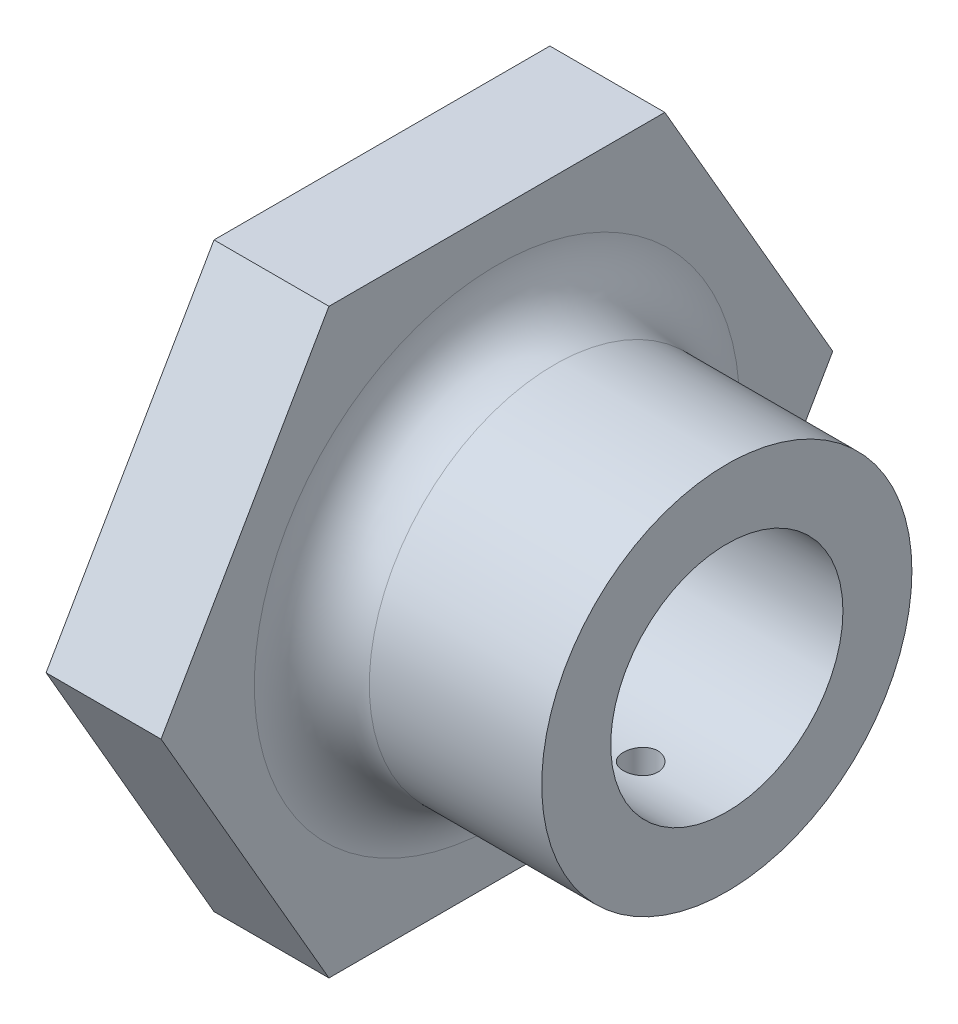
ISO-10303-21;
HEADER;
FILE_DESCRIPTION(('STEP AP214'),'2;1');
FILE_NAME('part.step','',(''),(''),'','','');
FILE_SCHEMA(('AUTOMOTIVE_DESIGN { 1 0 10303 214 1 1 1 1 }'));
ENDSEC;
DATA;
#1=APPLICATION_CONTEXT('core data for automotive mechanical design processes');
#2=APPLICATION_PROTOCOL_DEFINITION('international standard','automotive_design',2000,#1);
#3=PRODUCT_CONTEXT('',#1,'mechanical');
#4=PRODUCT('Part','Part','',(#3));
#5=PRODUCT_RELATED_PRODUCT_CATEGORY('part','',(#4));
#6=PRODUCT_DEFINITION_FORMATION('','',#4);
#7=PRODUCT_DEFINITION_CONTEXT('part definition',#1,'design');
#8=PRODUCT_DEFINITION('design','',#6,#7);
#9=PRODUCT_DEFINITION_SHAPE('','',#8);
#10=(LENGTH_UNIT() NAMED_UNIT(*) SI_UNIT(.MILLI.,.METRE.));
#11=(NAMED_UNIT(*) PLANE_ANGLE_UNIT() SI_UNIT($,.RADIAN.));
#12=(NAMED_UNIT(*) SI_UNIT($,.STERADIAN.) SOLID_ANGLE_UNIT());
#13=UNCERTAINTY_MEASURE_WITH_UNIT(LENGTH_MEASURE(1.E-05),#10,'distance_accuracy_value','');
#14=(GEOMETRIC_REPRESENTATION_CONTEXT(3) GLOBAL_UNCERTAINTY_ASSIGNED_CONTEXT((#13)) GLOBAL_UNIT_ASSIGNED_CONTEXT((#10,
#11,#12)) REPRESENTATION_CONTEXT('',''));
#15=CARTESIAN_POINT('',(0.,0.,0.));
#16=DIRECTION('',(0.,0.,1.));
#17=DIRECTION('',(1.,0.,0.));
#18=AXIS2_PLACEMENT_3D('',#15,#16,#17);
#19=CARTESIAN_POINT('',(10.,0.,0.));
#20=DIRECTION('',(1.,0.,0.));
#21=DIRECTION('',(0.,0.,-1.));
#22=AXIS2_PLACEMENT_3D('',#19,#20,#21);
#23=PLANE('',#22);
#24=CARTESIAN_POINT('',(10.,0.,0.));
#25=DIRECTION('',(1.,0.,0.));
#26=DIRECTION('',(0.,0.,-1.));
#27=AXIS2_PLACEMENT_3D('',#24,#25,#26);
#28=CIRCLE('',#27,21.1);
#29=CARTESIAN_POINT('',(10.,0.,-21.1));
#30=VERTEX_POINT('',#29);
#31=EDGE_CURVE('E11',#30,#30,#28,.F.);
#32=ORIENTED_EDGE('',*,*,#31,.T.);
#33=EDGE_LOOP('',(#32));
#34=FACE_BOUND('',#33,.T.);
#35=DIRECTION('',(0.,0.866025403784439,0.5));
#36=VECTOR('',#35,1.);
#37=CARTESIAN_POINT('',(10.,0.,-29.2139236209951));
#38=LINE('',#37,#36);
#39=CARTESIAN_POINT('',(10.,0.,-29.2139236209951));
#40=VERTEX_POINT('',#39);
#41=CARTESIAN_POINT('',(10.,25.3,-14.6069618104975));
#42=VERTEX_POINT('',#41);
#43=EDGE_CURVE('E155',#40,#42,#38,.T.);
#44=ORIENTED_EDGE('',*,*,#43,.T.);
#45=DIRECTION('',(0.,0.,1.));
#46=VECTOR('',#45,1.);
#47=CARTESIAN_POINT('',(10.,25.3,-14.6069618104975));
#48=LINE('',#47,#46);
#49=CARTESIAN_POINT('',(10.,25.3,14.6069618104975));
#50=VERTEX_POINT('',#49);
#51=EDGE_CURVE('E104',#42,#50,#48,.T.);
#52=ORIENTED_EDGE('',*,*,#51,.T.);
#53=DIRECTION('',(0.,-0.866025403784438,0.500000000000001));
#54=VECTOR('',#53,1.);
#55=CARTESIAN_POINT('',(10.,25.3,14.6069618104975));
#56=LINE('',#55,#54);
#57=CARTESIAN_POINT('',(10.,0.,29.2139236209951));
#58=VERTEX_POINT('',#57);
#59=EDGE_CURVE('E116',#50,#58,#56,.T.);
#60=ORIENTED_EDGE('',*,*,#59,.T.);
#61=DIRECTION('',(0.,-0.866025403784438,-0.500000000000001));
#62=VECTOR('',#61,1.);
#63=CARTESIAN_POINT('',(10.,0.,29.2139236209951));
#64=LINE('',#63,#62);
#65=CARTESIAN_POINT('',(10.,-25.3,14.6069618104975));
#66=VERTEX_POINT('',#65);
#67=EDGE_CURVE('E111',#58,#66,#64,.T.);
#68=ORIENTED_EDGE('',*,*,#67,.T.);
#69=DIRECTION('',(0.,0.,-1.));
#70=VECTOR('',#69,1.);
#71=CARTESIAN_POINT('',(10.,-25.3,14.6069618104975));
#72=LINE('',#71,#70);
#73=CARTESIAN_POINT('',(10.,-25.3,-14.6069618104975));
#74=VERTEX_POINT('',#73);
#75=EDGE_CURVE('E114',#66,#74,#72,.T.);
#76=ORIENTED_EDGE('',*,*,#75,.T.);
#77=DIRECTION('',(0.,0.866025403784438,-0.5));
#78=VECTOR('',#77,1.);
#79=CARTESIAN_POINT('',(10.,-25.3,-14.6069618104975));
#80=LINE('',#79,#78);
#81=EDGE_CURVE('E66',#74,#40,#80,.T.);
#82=ORIENTED_EDGE('',*,*,#81,.T.);
#83=EDGE_LOOP('',(#44,#52,#60,#68,#76,#82));
#84=FACE_BOUND('',#83,.T.);
#85=ADVANCED_FACE('F42',(#34,#84),#23,.T.);
#86=CARTESIAN_POINT('',(0.,0.,0.));
#87=DIRECTION('',(1.,0.,0.));
#88=DIRECTION('',(0.,0.,-1.));
#89=AXIS2_PLACEMENT_3D('',#86,#87,#88);
#90=PLANE('',#89);
#91=DIRECTION('',(0.,0.866025403784439,0.5));
#92=VECTOR('',#91,1.);
#93=CARTESIAN_POINT('',(0.,0.,-29.2139236209951));
#94=LINE('',#93,#92);
#95=CARTESIAN_POINT('',(0.,0.,-29.2139236209951));
#96=VERTEX_POINT('',#95);
#97=CARTESIAN_POINT('',(0.,25.3,-14.6069618104975));
#98=VERTEX_POINT('',#97);
#99=EDGE_CURVE('E138',#96,#98,#94,.T.);
#100=ORIENTED_EDGE('',*,*,#99,.F.);
#101=DIRECTION('',(0.,0.866025403784438,-0.5));
#102=VECTOR('',#101,1.);
#103=CARTESIAN_POINT('',(0.,-25.3,-14.6069618104975));
#104=LINE('',#103,#102);
#105=CARTESIAN_POINT('',(0.,-25.3,-14.6069618104975));
#106=VERTEX_POINT('',#105);
#107=EDGE_CURVE('E95',#106,#96,#104,.T.);
#108=ORIENTED_EDGE('',*,*,#107,.F.);
#109=DIRECTION('',(0.,0.,-1.));
#110=VECTOR('',#109,1.);
#111=CARTESIAN_POINT('',(0.,-25.3,14.6069618104975));
#112=LINE('',#111,#110);
#113=CARTESIAN_POINT('',(0.,-25.3,14.6069618104975));
#114=VERTEX_POINT('',#113);
#115=EDGE_CURVE('E89',#114,#106,#112,.T.);
#116=ORIENTED_EDGE('',*,*,#115,.F.);
#117=DIRECTION('',(0.,-0.866025403784438,-0.500000000000001));
#118=VECTOR('',#117,1.);
#119=CARTESIAN_POINT('',(0.,0.,29.2139236209951));
#120=LINE('',#119,#118);
#121=CARTESIAN_POINT('',(0.,0.,29.2139236209951));
#122=VERTEX_POINT('',#121);
#123=EDGE_CURVE('E125',#122,#114,#120,.T.);
#124=ORIENTED_EDGE('',*,*,#123,.F.);
#125=DIRECTION('',(0.,-0.866025403784438,0.500000000000001));
#126=VECTOR('',#125,1.);
#127=CARTESIAN_POINT('',(0.,25.3,14.6069618104975));
#128=LINE('',#127,#126);
#129=CARTESIAN_POINT('',(0.,25.3,14.6069618104975));
#130=VERTEX_POINT('',#129);
#131=EDGE_CURVE('E146',#130,#122,#128,.T.);
#132=ORIENTED_EDGE('',*,*,#131,.F.);
#133=DIRECTION('',(0.,0.,1.));
#134=VECTOR('',#133,1.);
#135=CARTESIAN_POINT('',(0.,25.3,-14.6069618104975));
#136=LINE('',#135,#134);
#137=EDGE_CURVE('E142',#98,#130,#136,.T.);
#138=ORIENTED_EDGE('',*,*,#137,.F.);
#139=EDGE_LOOP('',(#100,#108,#116,#124,#132,#138));
#140=FACE_BOUND('',#139,.T.);
#141=CARTESIAN_POINT('',(0.,0.,0.));
#142=DIRECTION('',(1.,0.,0.));
#143=DIRECTION('',(0.,0.,-1.));
#144=AXIS2_PLACEMENT_3D('',#141,#142,#143);
#145=CIRCLE('',#144,10.1);
#146=CARTESIAN_POINT('',(0.,0.,-10.1));
#147=VERTEX_POINT('',#146);
#148=EDGE_CURVE('E143',#147,#147,#145,.T.);
#149=ORIENTED_EDGE('',*,*,#148,.T.);
#150=EDGE_LOOP('',(#149));
#151=FACE_BOUND('',#150,.T.);
#152=ADVANCED_FACE('F189',(#140,#151),#90,.F.);
#153=CARTESIAN_POINT('',(10.,0.,-29.2139236209951));
#154=DIRECTION('',(0.,-0.5,0.866025403784439));
#155=DIRECTION('',(0.,-0.866025403784439,-0.5));
#156=AXIS2_PLACEMENT_3D('',#153,#154,#155);
#157=PLANE('',#156);
#158=ORIENTED_EDGE('',*,*,#99,.T.);
#159=DIRECTION('',(-1.,0.,0.));
#160=VECTOR('',#159,1.);
#161=CARTESIAN_POINT('',(10.,25.3,-14.6069618104975));
#162=LINE('',#161,#160);
#163=EDGE_CURVE('E166',#42,#98,#162,.T.);
#164=ORIENTED_EDGE('',*,*,#163,.F.);
#165=ORIENTED_EDGE('',*,*,#43,.F.);
#166=DIRECTION('',(-1.,0.,0.));
#167=VECTOR('',#166,1.);
#168=CARTESIAN_POINT('',(10.,0.,-29.2139236209951));
#169=LINE('',#168,#167);
#170=EDGE_CURVE('E134',#40,#96,#169,.T.);
#171=ORIENTED_EDGE('',*,*,#170,.T.);
#172=EDGE_LOOP('',(#158,#164,#165,#171));
#173=FACE_BOUND('',#172,.T.);
#174=ADVANCED_FACE('F195',(#173),#157,.F.);
#175=CARTESIAN_POINT('',(10.,25.3,-14.6069618104975));
#176=DIRECTION('',(0.,-1.,0.));
#177=DIRECTION('',(0.,0.,-1.));
#178=AXIS2_PLACEMENT_3D('',#175,#176,#177);
#179=PLANE('',#178);
#180=ORIENTED_EDGE('',*,*,#137,.T.);
#181=DIRECTION('',(-1.,0.,0.));
#182=VECTOR('',#181,1.);
#183=CARTESIAN_POINT('',(10.,25.3,14.6069618104975));
#184=LINE('',#183,#182);
#185=EDGE_CURVE('E162',#50,#130,#184,.T.);
#186=ORIENTED_EDGE('',*,*,#185,.F.);
#187=ORIENTED_EDGE('',*,*,#51,.F.);
#188=ORIENTED_EDGE('',*,*,#163,.T.);
#189=EDGE_LOOP('',(#180,#186,#187,#188));
#190=FACE_BOUND('',#189,.T.);
#191=ADVANCED_FACE('F212',(#190),#179,.F.);
#192=CARTESIAN_POINT('',(10.,25.3,14.6069618104975));
#193=DIRECTION('',(0.,-0.500000000000001,-0.866025403784438));
#194=DIRECTION('',(0.,0.866025403784438,-0.500000000000001));
#195=AXIS2_PLACEMENT_3D('',#192,#193,#194);
#196=PLANE('',#195);
#197=ORIENTED_EDGE('',*,*,#131,.T.);
#198=DIRECTION('',(-1.,0.,0.));
#199=VECTOR('',#198,1.);
#200=CARTESIAN_POINT('',(10.,0.,29.2139236209951));
#201=LINE('',#200,#199);
#202=EDGE_CURVE('E127',#58,#122,#201,.T.);
#203=ORIENTED_EDGE('',*,*,#202,.F.);
#204=ORIENTED_EDGE('',*,*,#59,.F.);
#205=ORIENTED_EDGE('',*,*,#185,.T.);
#206=EDGE_LOOP('',(#197,#203,#204,#205));
#207=FACE_BOUND('',#206,.T.);
#208=ADVANCED_FACE('F209',(#207),#196,.F.);
#209=CARTESIAN_POINT('',(10.,0.,29.2139236209951));
#210=DIRECTION('',(0.,0.500000000000001,-0.866025403784438));
#211=DIRECTION('',(0.,0.866025403784438,0.500000000000001));
#212=AXIS2_PLACEMENT_3D('',#209,#210,#211);
#213=PLANE('',#212);
#214=ORIENTED_EDGE('',*,*,#123,.T.);
#215=DIRECTION('',(-1.,0.,0.));
#216=VECTOR('',#215,1.);
#217=CARTESIAN_POINT('',(10.,-25.3,14.6069618104975));
#218=LINE('',#217,#216);
#219=EDGE_CURVE('E122',#66,#114,#218,.T.);
#220=ORIENTED_EDGE('',*,*,#219,.F.);
#221=ORIENTED_EDGE('',*,*,#67,.F.);
#222=ORIENTED_EDGE('',*,*,#202,.T.);
#223=EDGE_LOOP('',(#214,#220,#221,#222));
#224=FACE_BOUND('',#223,.T.);
#225=ADVANCED_FACE('F123',(#224),#213,.F.);
#226=CARTESIAN_POINT('',(10.,-25.3,14.6069618104975));
#227=DIRECTION('',(0.,1.,0.));
#228=DIRECTION('',(0.,0.,1.));
#229=AXIS2_PLACEMENT_3D('',#226,#227,#228);
#230=PLANE('',#229);
#231=ORIENTED_EDGE('',*,*,#115,.T.);
#232=DIRECTION('',(-1.,0.,0.));
#233=VECTOR('',#232,1.);
#234=CARTESIAN_POINT('',(10.,-25.3,-14.6069618104975));
#235=LINE('',#234,#233);
#236=EDGE_CURVE('E128',#74,#106,#235,.T.);
#237=ORIENTED_EDGE('',*,*,#236,.F.);
#238=ORIENTED_EDGE('',*,*,#75,.F.);
#239=ORIENTED_EDGE('',*,*,#219,.T.);
#240=EDGE_LOOP('',(#231,#237,#238,#239));
#241=FACE_BOUND('',#240,.T.);
#242=ADVANCED_FACE('F130',(#241),#230,.F.);
#243=CARTESIAN_POINT('',(10.,-25.3,-14.6069618104975));
#244=DIRECTION('',(0.,0.5,0.866025403784439));
#245=DIRECTION('',(0.,-0.866025403784439,0.5));
#246=AXIS2_PLACEMENT_3D('',#243,#244,#245);
#247=PLANE('',#246);
#248=ORIENTED_EDGE('',*,*,#107,.T.);
#249=ORIENTED_EDGE('',*,*,#170,.F.);
#250=ORIENTED_EDGE('',*,*,#81,.F.);
#251=ORIENTED_EDGE('',*,*,#236,.T.);
#252=EDGE_LOOP('',(#248,#249,#250,#251));
#253=FACE_BOUND('',#252,.T.);
#254=ADVANCED_FACE('F202',(#253),#247,.F.);
#255=CARTESIAN_POINT('',(10.,0.,0.));
#256=DIRECTION('',(-1.,0.,0.));
#257=DIRECTION('',(0.,0.,1.));
#258=AXIS2_PLACEMENT_3D('',#255,#256,#257);
#259=CYLINDRICAL_SURFACE('',#258,10.1);
#260=CARTESIAN_POINT('',(22.5,-9.98799279134702,1.5));
#261=CARTESIAN_POINT('',(22.5837556512332,-9.9879941807315,1.49999653344231));
#262=CARTESIAN_POINT('',(22.6675601617615,-9.98905770648355,1.49296127254229));
#263=CARTESIAN_POINT('',(22.8328267929498,-9.99319409703962,1.4650131891143));
#264=CARTESIAN_POINT('',(22.9142865366908,-9.9962689306879,1.4440867684053));
#265=CARTESIAN_POINT('',(23.0724474787311,-10.0040721668359,1.38899565010733));
#266=CARTESIAN_POINT('',(23.149152250213,-10.0087993095095,1.3548410364022));
#267=CARTESIAN_POINT('',(23.2957309647537,-10.0193730361715,1.27428666965844));
#268=CARTESIAN_POINT('',(23.3656058608875,-10.0252194636316,1.22788862848154));
#269=CARTESIAN_POINT('',(23.4971009366153,-10.0374243377324,1.12377540451144));
#270=CARTESIAN_POINT('',(23.5586597230782,-10.0437860907059,1.06598306009875));
#271=CARTESIAN_POINT('',(23.6712432372395,-10.0562752827391,0.940888332795035));
#272=CARTESIAN_POINT('',(23.7222673894038,-10.062402708982,0.873585430655923));
#273=CARTESIAN_POINT('',(23.8125593921792,-10.0737674010683,0.730987203197164));
#274=CARTESIAN_POINT('',(23.8517707657327,-10.0790003404198,0.655655742883641));
#275=CARTESIAN_POINT('',(23.9169617566082,-10.0879498450303,0.499385477087391));
#276=CARTESIAN_POINT('',(23.9429420595836,-10.091666488864,0.418446962417423));
#277=CARTESIAN_POINT('',(23.980747474383,-10.0971413144263,0.253892161972045));
#278=CARTESIAN_POINT('',(23.9926753521047,-10.0989137078675,0.170299966480003));
#279=CARTESIAN_POINT('',(24.0023563839315,-10.1003490286794,0.00228305764693207));
#280=CARTESIAN_POINT('',(24.0001103112272,-10.1000120711155,-0.0821416100318046));
#281=CARTESIAN_POINT('',(23.9815883797276,-10.0972780203372,-0.248725950780093));
#282=CARTESIAN_POINT('',(23.9654230786419,-10.094897161874,-0.330898220633102));
#283=CARTESIAN_POINT('',(23.919695058241,-10.088360916662,-0.491350729660537));
#284=CARTESIAN_POINT('',(23.8901319996451,-10.0842054849745,-0.569630870216146));
#285=CARTESIAN_POINT('',(23.8183341879558,-10.0745590881838,-0.720412155832025));
#286=CARTESIAN_POINT('',(23.776052808761,-10.0690632232448,-0.792890772625558));
#287=CARTESIAN_POINT('',(23.6800526028127,-10.0573486227851,-0.929765956778822));
#288=CARTESIAN_POINT('',(23.6263330378038,-10.051129840617,-0.994162002038074));
#289=CARTESIAN_POINT('',(23.5083652560932,-10.03859232388,-1.11369563859232));
#290=CARTESIAN_POINT('',(23.44402052403,-10.0322732037026,-1.1687379815968));
#291=CARTESIAN_POINT('',(23.3069570643873,-10.0203057456663,-1.26725821808431));
#292=CARTESIAN_POINT('',(23.2342382871509,-10.0146574117855,-1.31073604298635));
#293=CARTESIAN_POINT('',(23.0823926007829,-10.0046711709491,-1.38490545914184));
#294=CARTESIAN_POINT('',(23.0032609080838,-10.000334253838,-1.41558739877766));
#295=CARTESIAN_POINT('',(22.840888884425,-9.99347951155194,-1.46319899968337));
#296=CARTESIAN_POINT('',(22.7576488374597,-9.99096156082662,-1.48012961012051));
#297=CARTESIAN_POINT('',(22.5902700235005,-9.98805360190675,-1.49962761276662));
#298=CARTESIAN_POINT('',(22.5061473130276,-9.9876436002483,-1.50232996303392));
#299=CARTESIAN_POINT('',(22.3386501996047,-9.98894489300218,-1.49365271180531));
#300=CARTESIAN_POINT('',(22.2552757739864,-9.99065612293453,-1.48227353835142));
#301=CARTESIAN_POINT('',(22.0920591507292,-9.99598870786081,-1.44587066238782));
#302=CARTESIAN_POINT('',(22.0122016501112,-9.99960066436801,-1.42091407548796));
#303=CARTESIAN_POINT('',(21.8578033759366,-10.0083199834493,-1.3581345672902));
#304=CARTESIAN_POINT('',(21.7832628603966,-10.0134274185329,-1.32031102211212));
#305=CARTESIAN_POINT('',(21.6410091493569,-10.0246093694854,-1.23254652968968));
#306=CARTESIAN_POINT('',(21.5733504468162,-10.0306907495831,-1.18251814675273));
#307=CARTESIAN_POINT('',(21.4473408532376,-10.0431146428354,-1.07188578120655));
#308=CARTESIAN_POINT('',(21.3889904781607,-10.0494571704408,-1.0112812127487));
#309=CARTESIAN_POINT('',(21.2827698936081,-10.0617511338477,-0.880622772605109));
#310=CARTESIAN_POINT('',(21.23498907492,-10.0676989565668,-0.810495839364267));
#311=CARTESIAN_POINT('',(21.1518864466953,-10.0784773442146,-0.663132492509454));
#312=CARTESIAN_POINT('',(21.1165643018062,-10.0833079392147,-0.585896270328215));
#313=CARTESIAN_POINT('',(21.0595248253742,-10.091291750582,-0.426787036624583));
#314=CARTESIAN_POINT('',(21.0377584399907,-10.0944510086439,-0.344931926490835));
#315=CARTESIAN_POINT('',(21.0082895419628,-10.0987615273987,-0.178678114676162));
#316=CARTESIAN_POINT('',(21.0005861195543,-10.0999129179848,-0.0942795778942366));
#317=CARTESIAN_POINT('',(20.9994836894086,-10.1000767141153,0.0737979593676888));
#318=CARTESIAN_POINT('',(21.0059478396523,-10.0991095821349,0.157476074593947));
#319=CARTESIAN_POINT('',(21.0327039715024,-10.0951862237568,0.322541533858875));
#320=CARTESIAN_POINT('',(21.0529959113936,-10.0922300033599,0.403928884807488));
#321=CARTESIAN_POINT('',(21.1067834093708,-10.0846590903396,0.562066195806304));
#322=CARTESIAN_POINT('',(21.1402696768113,-10.0800455648914,0.638819375198153));
#323=CARTESIAN_POINT('',(21.2194807173352,-10.069667038128,0.785639125019117));
#324=CARTESIAN_POINT('',(21.2652058719708,-10.0639020009153,0.855705486891522));
#325=CARTESIAN_POINT('',(21.3680922903111,-10.0517952900267,0.987857096280019));
#326=CARTESIAN_POINT('',(21.425354648869,-10.0454488102282,1.04986320334181));
#327=CARTESIAN_POINT('',(21.5494773638831,-10.0329302424009,1.1634362846356));
#328=CARTESIAN_POINT('',(21.6163399707425,-10.0267581956683,1.21500080439535));
#329=CARTESIAN_POINT('',(21.7581971799622,-10.0152509195948,1.30648105394677));
#330=CARTESIAN_POINT('',(21.8332344943531,-10.0099204805119,1.34633114128171));
#331=CARTESIAN_POINT('',(21.9889805728329,-10.000756103769,1.41280326563462));
#332=CARTESIAN_POINT('',(22.0696833325055,-9.99692060915421,1.43943907299511));
#333=CARTESIAN_POINT('',(22.2089601817421,-9.99206944883039,1.47266011989249));
#334=CARTESIAN_POINT('',(22.266672788426,-9.99054877580241,1.48289694940458));
#335=CARTESIAN_POINT('',(22.3829156436067,-9.98850996769776,1.49656805845126));
#336=CARTESIAN_POINT('',(22.4414458818164,-9.98799182001933,1.50000242349293));
#337=CARTESIAN_POINT('',(22.5,-9.98799279134702,1.5));
#338=B_SPLINE_CURVE_WITH_KNOTS('',3,(#260,#261,#262,#263,#264,#265,#266,#267,#268,#269,#270,
#271,#272,#273,#274,#275,#276,#277,#278,#279,#280,#281,#282,#283,#284,#285,#286,#287,#288,#289,
#290,#291,#292,#293,#294,#295,#296,#297,#298,#299,#300,#301,#302,#303,#304,#305,#306,#307,#308,
#309,#310,#311,#312,#313,#314,#315,#316,#317,#318,#319,#320,#321,#322,#323,#324,#325,#326,#327,
#328,#329,#330,#331,#332,#333,#334,#335,#336,#337),.UNSPECIFIED.,.T.,.F.,(4,2,2,2,2,2,2,2,2,2,2,
2,2,2,2,2,2,2,2,2,2,2,2,2,2,2,2,2,2,2,2,2,2,2,2,2,2,2,4),(0.,0.251052939289686,
0.502351999686483,0.753459870049478,1.0045326493895,1.25736800199838,1.51021716400056,
1.76425668667206,2.01828304330335,2.27043993132932,2.52258306428745,2.77274175588819,
3.02290678278592,3.27400034429635,3.52511011706741,3.77864088688003,4.03217316017108,
4.28589632218243,4.53960196980048,4.79089677283443,5.04218393734159,5.29224008330331,
5.54230835546528,5.79422363077425,6.04615286490504,6.30013756263746,6.55411542329113,
6.80716879835763,7.06020580226047,7.31080954721575,7.56141253616009,7.81183938011412,
8.06227403213844,8.31500684097345,8.56779899015403,8.82198179176443,9.07589915513671,
9.25141409706726,9.42692683275827),.UNSPECIFIED.);
#339=CARTESIAN_POINT('',(22.5,-9.98799279134702,1.5));
#340=VERTEX_POINT('',#339);
#341=EDGE_CURVE('E241',#340,#340,#338,.T.);
#342=ORIENTED_EDGE('',*,*,#341,.F.);
#343=EDGE_LOOP('',(#342));
#344=FACE_BOUND('',#343,.T.);
#345=ORIENTED_EDGE('',*,*,#148,.F.);
#346=EDGE_LOOP('',(#345));
#347=FACE_BOUND('',#346,.T.);
#348=CARTESIAN_POINT('',(30.,0.,0.));
#349=DIRECTION('',(1.,0.,0.));
#350=DIRECTION('',(0.,0.,-1.));
#351=AXIS2_PLACEMENT_3D('',#348,#349,#350);
#352=CIRCLE('',#351,10.1);
#353=CARTESIAN_POINT('',(30.,0.,-10.1));
#354=VERTEX_POINT('',#353);
#355=EDGE_CURVE('E237',#354,#354,#352,.T.);
#356=ORIENTED_EDGE('',*,*,#355,.T.);
#357=EDGE_LOOP('',(#356));
#358=FACE_BOUND('',#357,.T.);
#359=ADVANCED_FACE('F199',(#344,#347,#358),#259,.F.);
#360=CARTESIAN_POINT('',(30.,0.,0.));
#361=DIRECTION('',(1.,0.,0.));
#362=DIRECTION('',(0.,0.,-1.));
#363=AXIS2_PLACEMENT_3D('',#360,#361,#362);
#364=PLANE('',#363);
#365=CARTESIAN_POINT('',(30.,0.,0.));
#366=DIRECTION('',(1.,0.,0.));
#367=DIRECTION('',(0.,0.,-1.));
#368=AXIS2_PLACEMENT_3D('',#365,#366,#367);
#369=CIRCLE('',#368,16.1);
#370=CARTESIAN_POINT('',(30.,0.,-16.1));
#371=VERTEX_POINT('',#370);
#372=EDGE_CURVE('E233',#371,#371,#369,.T.);
#373=ORIENTED_EDGE('',*,*,#372,.T.);
#374=EDGE_LOOP('',(#373));
#375=FACE_BOUND('',#374,.T.);
#376=ORIENTED_EDGE('',*,*,#355,.F.);
#377=EDGE_LOOP('',(#376));
#378=FACE_BOUND('',#377,.T.);
#379=ADVANCED_FACE('F185',(#375,#378),#364,.T.);
#380=CARTESIAN_POINT('',(30.,0.,0.));
#381=DIRECTION('',(-1.,0.,0.));
#382=DIRECTION('',(0.,0.,1.));
#383=AXIS2_PLACEMENT_3D('',#380,#381,#382);
#384=CYLINDRICAL_SURFACE('',#383,16.1);
#385=CARTESIAN_POINT('',(22.5,-16.0299719276111,1.5));
#386=CARTESIAN_POINT('',(22.5840592501496,-16.0299728497904,1.49999634498692));
#387=CARTESIAN_POINT('',(22.6681747917923,-16.0306402451053,1.49291025613508));
#388=CARTESIAN_POINT('',(22.8340758013856,-16.0332374942556,1.46474833926044));
#389=CARTESIAN_POINT('',(22.9158585640107,-16.0351687562643,1.44365690639751));
#390=CARTESIAN_POINT('',(23.0746673677219,-16.0400731231192,1.38810197887314));
#391=CARTESIAN_POINT('',(23.1516961808061,-16.04304561395,1.3536463638246));
#392=CARTESIAN_POINT('',(23.2988597849468,-16.0496967527322,1.27235580486276));
#393=CARTESIAN_POINT('',(23.3689959862935,-16.0533752557705,1.22552340061651));
#394=CARTESIAN_POINT('',(23.5006234861882,-16.0610370367532,1.12064860541131));
#395=CARTESIAN_POINT('',(23.5620898487368,-16.0650211448981,1.0625749751773));
#396=CARTESIAN_POINT('',(23.6744183432874,-16.0728376652083,0.936932740996461));
#397=CARTESIAN_POINT('',(23.7252799996507,-16.0766700705631,0.869363711392745));
#398=CARTESIAN_POINT('',(23.8150402749692,-16.083759451814,0.726497474483341));
#399=CARTESIAN_POINT('',(23.8539170108601,-16.0870153705546,0.6511864615201));
#400=CARTESIAN_POINT('',(23.9184638962471,-16.0925759241743,0.495070100477831));
#401=CARTESIAN_POINT('',(23.9441343284052,-16.0948805794137,0.414264870036535));
#402=CARTESIAN_POINT('',(23.9814672932247,-16.0982731161451,0.249704415849696));
#403=CARTESIAN_POINT('',(23.9931705563301,-16.0993645349823,0.165958506484596));
#404=CARTESIAN_POINT('',(24.002362948146,-16.1002196389868,-0.00231553054374454));
#405=CARTESIAN_POINT('',(23.999852400444,-16.0999833543801,-0.0868436403558929));
#406=CARTESIAN_POINT('',(23.9807216046853,-16.0982125793274,-0.254006277368956));
#407=CARTESIAN_POINT('',(23.9641451546481,-16.0966821187022,-0.336645865639557));
#408=CARTESIAN_POINT('',(23.9174212745795,-16.092499683372,-0.497964770497923));
#409=CARTESIAN_POINT('',(23.8872736883897,-16.089847695762,-0.576644041504119));
#410=CARTESIAN_POINT('',(23.8142149512769,-16.0837135135122,-0.727947521680124));
#411=CARTESIAN_POINT('',(23.7712843181342,-16.0802300532718,-0.800562270232744));
#412=CARTESIAN_POINT('',(23.6738922754499,-16.072824056366,-0.937572197007369));
#413=CARTESIAN_POINT('',(23.6194305727146,-16.0689015085376,-1.0019671661631));
#414=CARTESIAN_POINT('',(23.5002758093668,-16.0610402150312,-1.12096593546461));
#415=CARTESIAN_POINT('',(23.4355446667812,-16.0571014644282,-1.17553161057198));
#416=CARTESIAN_POINT('',(23.2978208303676,-16.0496666063899,-1.27302797687826));
#417=CARTESIAN_POINT('',(23.2248281269933,-16.0461704994663,-1.31595865463265));
#418=CARTESIAN_POINT('',(23.0726249571737,-16.040016318351,-1.38896565013199));
#419=CARTESIAN_POINT('',(22.9934134329459,-16.0373583871153,-1.41903977542646));
#420=CARTESIAN_POINT('',(22.8310348851485,-16.0331844059277,-1.46545064244877));
#421=CARTESIAN_POINT('',(22.7478679659519,-16.0316683258631,-1.48178774644938));
#422=CARTESIAN_POINT('',(22.5802736593801,-16.0299547898693,-1.50021211493515));
#423=CARTESIAN_POINT('',(22.4958521757443,-16.0297524052526,-1.50235264241709));
#424=CARTESIAN_POINT('',(22.3278516635449,-16.0306761687569,-1.49246282163436));
#425=CARTESIAN_POINT('',(22.2442726251362,-16.0318023013342,-1.48043263916784));
#426=CARTESIAN_POINT('',(22.0804837457577,-16.0352517253871,-1.44258738531396));
#427=CARTESIAN_POINT('',(22.000268068606,-16.0375728417136,-1.41679735696759));
#428=CARTESIAN_POINT('',(21.8453017979668,-16.0431489229498,-1.3521900151686));
#429=CARTESIAN_POINT('',(21.7705513136102,-16.046403906501,-1.31337244166354));
#430=CARTESIAN_POINT('',(21.6283941302518,-16.0534929095685,-1.22367788699186));
#431=CARTESIAN_POINT('',(21.5610098402546,-16.0573286156961,-1.17276552506655));
#432=CARTESIAN_POINT('',(21.4357247531286,-16.0651412814659,-1.06037748662455));
#433=CARTESIAN_POINT('',(21.3778241598206,-16.0691182441416,-0.998901583137491));
#434=CARTESIAN_POINT('',(21.2729671818428,-16.0767801138672,-0.866900857264392));
#435=CARTESIAN_POINT('',(21.2260454832951,-16.080464071647,-0.796348418646156));
#436=CARTESIAN_POINT('',(21.1447166156529,-16.0871110925285,-0.648334266125259));
#437=CARTESIAN_POINT('',(21.1103092949183,-16.0900741643654,-0.570872635957297));
#438=CARTESIAN_POINT('',(21.0550449974911,-16.0949412356913,-0.411361414784528));
#439=CARTESIAN_POINT('',(21.0341668556495,-16.0968468887398,-0.329319209159128));
#440=CARTESIAN_POINT('',(21.0064844507922,-16.099391163097,-0.162875173126298));
#441=CARTESIAN_POINT('',(20.9996798480793,-16.1000298149875,-0.0784733997222977));
#442=CARTESIAN_POINT('',(21.0003420977008,-16.0999681403342,0.0899527033110918));
#443=CARTESIAN_POINT('',(21.0077550136005,-16.0992728742187,0.173977252103563));
#444=CARTESIAN_POINT('',(21.0365290430993,-16.0966314730393,0.339582152952465));
#445=CARTESIAN_POINT('',(21.0578901713878,-16.0946853366581,0.421162502434707));
#446=CARTESIAN_POINT('',(21.1139398345398,-16.0897603710797,0.579564475638269));
#447=CARTESIAN_POINT('',(21.148627046282,-16.0867816444092,0.656386570918429));
#448=CARTESIAN_POINT('',(21.2303383392881,-16.0801240577757,0.803126207359973));
#449=CARTESIAN_POINT('',(21.2773622956182,-16.0764452049028,0.873043818432896));
#450=CARTESIAN_POINT('',(21.3826147462513,-16.0687831729462,1.00426613206866));
#451=CARTESIAN_POINT('',(21.4408833295217,-16.064798936711,1.06553861814547));
#452=CARTESIAN_POINT('',(21.5668942051625,-16.056984176254,1.17746152644142));
#453=CARTESIAN_POINT('',(21.634638776259,-16.053153689291,1.22810938637239));
#454=CARTESIAN_POINT('',(21.7778421666177,-16.0460708612874,1.31743245999413));
#455=CARTESIAN_POINT('',(21.8533180003189,-16.0428198404941,1.3560804782702));
#456=CARTESIAN_POINT('',(22.0096685051528,-16.0372799052447,1.42010401486232));
#457=CARTESIAN_POINT('',(22.0905369171767,-16.0349898971249,1.44549462861921));
#458=CARTESIAN_POINT('',(22.2265597218765,-16.0322137336622,1.47589247948738));
#459=CARTESIAN_POINT('',(22.2808421625205,-16.0313769838108,1.48492059134043));
#460=CARTESIAN_POINT('',(22.3900750448213,-16.0302557802056,1.49697553622279));
#461=CARTESIAN_POINT('',(22.4450254841269,-16.0299713245084,1.50000239036839));
#462=CARTESIAN_POINT('',(22.5,-16.0299719276111,1.5));
#463=B_SPLINE_CURVE_WITH_KNOTS('',3,(#385,#386,#387,#388,#389,#390,#391,#392,#393,#394,#395,
#396,#397,#398,#399,#400,#401,#402,#403,#404,#405,#406,#407,#408,#409,#410,#411,#412,#413,#414,
#415,#416,#417,#418,#419,#420,#421,#422,#423,#424,#425,#426,#427,#428,#429,#430,#431,#432,#433,
#434,#435,#436,#437,#438,#439,#440,#441,#442,#443,#444,#445,#446,#447,#448,#449,#450,#451,#452,
#453,#454,#455,#456,#457,#458,#459,#460,#461,#462),.UNSPECIFIED.,.T.,.F.,(4,2,2,2,2,2,2,2,2,2,2,
2,2,2,2,2,2,2,2,2,2,2,2,2,2,2,2,2,2,2,2,2,2,2,2,2,2,2,4),(0.,0.251977008583383,0.50423524364347,
0.756344971069946,1.00840300671325,1.26117183548266,1.51395199891319,1.76719101247832,
2.02042460560142,2.27291791140629,2.52540546904298,2.77710971068349,3.02881684867074,
3.28090958601486,3.53300873394357,3.78606558233954,4.03912272314784,4.29222300103694,
4.545316603955,4.79746010548839,5.04960065695698,5.30128386802141,5.5529721034189,
5.80540586824188,6.05784505758567,6.31107133388543,6.56429454167193,6.81712064264282,
7.06994064100369,7.32180342299772,7.57366647023992,7.82550451694559,8.07734001339688,
8.33009051017205,8.58290189162721,8.83628211020887,9.08937318672428,9.25416602957043,
9.41895829256785),.UNSPECIFIED.);
#464=CARTESIAN_POINT('',(22.5,-16.0299719276111,1.5));
#465=VERTEX_POINT('',#464);
#466=EDGE_CURVE('E46',#465,#465,#463,.T.);
#467=ORIENTED_EDGE('',*,*,#466,.T.);
#468=EDGE_LOOP('',(#467));
#469=FACE_BOUND('',#468,.T.);
#470=CARTESIAN_POINT('',(15.,0.,0.));
#471=DIRECTION('',(1.,0.,0.));
#472=DIRECTION('',(0.,0.,-1.));
#473=AXIS2_PLACEMENT_3D('',#470,#471,#472);
#474=CIRCLE('',#473,16.1);
#475=CARTESIAN_POINT('',(15.,0.,-16.1));
#476=VERTEX_POINT('',#475);
#477=EDGE_CURVE('E58',#476,#476,#474,.T.);
#478=ORIENTED_EDGE('',*,*,#477,.T.);
#479=EDGE_LOOP('',(#478));
#480=FACE_BOUND('',#479,.T.);
#481=ORIENTED_EDGE('',*,*,#372,.F.);
#482=EDGE_LOOP('',(#481));
#483=FACE_BOUND('',#482,.T.);
#484=ADVANCED_FACE('F173',(#469,#480,#483),#384,.T.);
#485=CARTESIAN_POINT('',(15.,0.,0.));
#486=DIRECTION('',(1.,0.,0.));
#487=DIRECTION('',(0.,0.,-1.));
#488=AXIS2_PLACEMENT_3D('',#485,#486,#487);
#489=TOROIDAL_SURFACE('',#488,21.1,5.);
#490=ORIENTED_EDGE('',*,*,#31,.F.);
#491=EDGE_LOOP('',(#490));
#492=FACE_BOUND('',#491,.T.);
#493=ORIENTED_EDGE('',*,*,#477,.F.);
#494=EDGE_LOOP('',(#493));
#495=FACE_BOUND('',#494,.T.);
#496=ADVANCED_FACE('F44',(#492,#495),#489,.F.);
#497=CARTESIAN_POINT('',(22.5,-20.,0.));
#498=DIRECTION('',(0.,1.,0.));
#499=DIRECTION('',(0.,0.,1.));
#500=AXIS2_PLACEMENT_3D('',#497,#498,#499);
#501=CYLINDRICAL_SURFACE('',#500,1.5);
#502=ORIENTED_EDGE('',*,*,#341,.T.);
#503=EDGE_LOOP('',(#502));
#504=FACE_BOUND('',#503,.T.);
#505=ORIENTED_EDGE('',*,*,#466,.F.);
#506=EDGE_LOOP('',(#505));
#507=FACE_BOUND('',#506,.T.);
#508=ADVANCED_FACE('F177',(#504,#507),#501,.F.);
#509=CLOSED_SHELL('',(#85,#152,#174,#191,#208,#225,#242,#254,#359,#379,#484,#496,#508));
#510=MANIFOLD_SOLID_BREP('B2',#509);
#511=ADVANCED_BREP_SHAPE_REPRESENTATION('',(#18,#510),#14);
#512=SHAPE_DEFINITION_REPRESENTATION(#9,#511);
ENDSEC;
END-ISO-10303-21;
